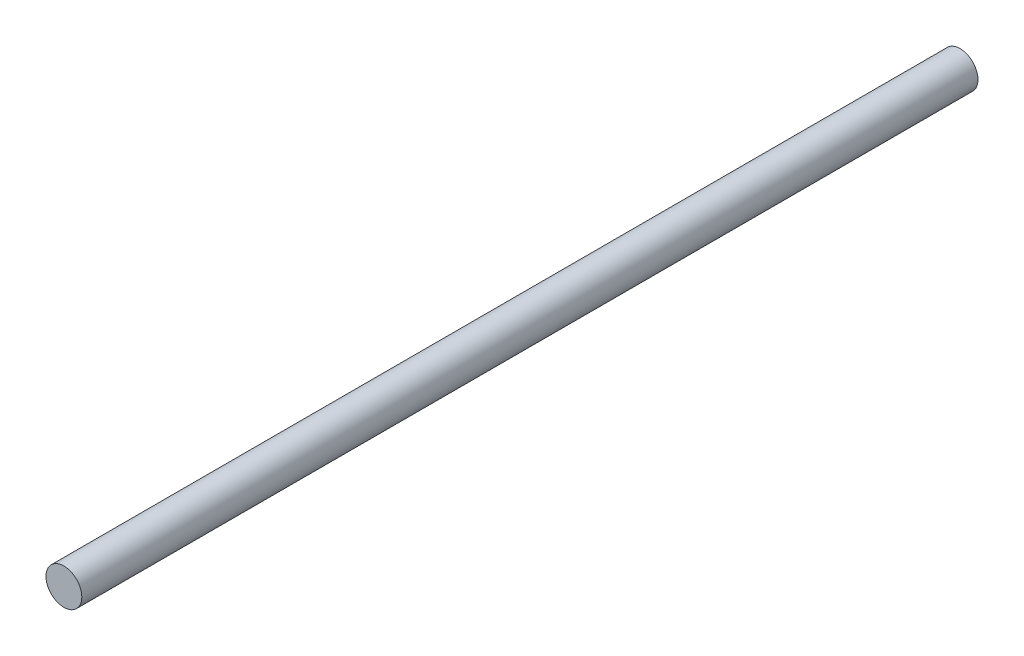
ISO-10303-21;
HEADER;
FILE_DESCRIPTION(('STEP AP214'),'2;1');
FILE_NAME('part.step','',(''),(''),'','','');
FILE_SCHEMA(('AUTOMOTIVE_DESIGN { 1 0 10303 214 1 1 1 1 }'));
ENDSEC;
DATA;
#1=APPLICATION_CONTEXT('core data for automotive mechanical design processes');
#2=APPLICATION_PROTOCOL_DEFINITION('international standard','automotive_design',2000,#1);
#3=PRODUCT_CONTEXT('',#1,'mechanical');
#4=PRODUCT('Part','Part','',(#3));
#5=PRODUCT_RELATED_PRODUCT_CATEGORY('part','',(#4));
#6=PRODUCT_DEFINITION_FORMATION('','',#4);
#7=PRODUCT_DEFINITION_CONTEXT('part definition',#1,'design');
#8=PRODUCT_DEFINITION('design','',#6,#7);
#9=PRODUCT_DEFINITION_SHAPE('','',#8);
#10=(LENGTH_UNIT() NAMED_UNIT(*) SI_UNIT(.MILLI.,.METRE.));
#11=(NAMED_UNIT(*) PLANE_ANGLE_UNIT() SI_UNIT($,.RADIAN.));
#12=(NAMED_UNIT(*) SI_UNIT($,.STERADIAN.) SOLID_ANGLE_UNIT());
#13=UNCERTAINTY_MEASURE_WITH_UNIT(LENGTH_MEASURE(1.E-05),#10,'distance_accuracy_value','');
#14=(GEOMETRIC_REPRESENTATION_CONTEXT(3) GLOBAL_UNCERTAINTY_ASSIGNED_CONTEXT((#13)) GLOBAL_UNIT_ASSIGNED_CONTEXT((#10,
#11,#12)) REPRESENTATION_CONTEXT('',''));
#15=CARTESIAN_POINT('',(0.,0.,0.));
#16=DIRECTION('',(0.,0.,1.));
#17=DIRECTION('',(1.,0.,0.));
#18=AXIS2_PLACEMENT_3D('',#15,#16,#17);
#19=CARTESIAN_POINT('',(0.,0.,500.));
#20=DIRECTION('',(0.,0.,-1.));
#21=DIRECTION('',(-1.,0.,0.));
#22=AXIS2_PLACEMENT_3D('',#19,#20,#21);
#23=CYLINDRICAL_SURFACE('',#22,10.);
#24=CARTESIAN_POINT('',(0.,0.,500.));
#25=DIRECTION('',(0.,0.,1.));
#26=DIRECTION('',(1.,0.,0.));
#27=AXIS2_PLACEMENT_3D('',#24,#25,#26);
#28=CIRCLE('',#27,10.);
#29=CARTESIAN_POINT('',(10.,0.,500.));
#30=VERTEX_POINT('',#29);
#31=EDGE_CURVE('E10',#30,#30,#28,.T.);
#32=ORIENTED_EDGE('',*,*,#31,.F.);
#33=EDGE_LOOP('',(#32));
#34=FACE_BOUND('',#33,.T.);
#35=CARTESIAN_POINT('',(0.,0.,0.));
#36=DIRECTION('',(0.,0.,1.));
#37=DIRECTION('',(1.,0.,0.));
#38=AXIS2_PLACEMENT_3D('',#35,#36,#37);
#39=CIRCLE('',#38,10.);
#40=CARTESIAN_POINT('',(10.,0.,0.));
#41=VERTEX_POINT('',#40);
#42=EDGE_CURVE('E38',#41,#41,#39,.T.);
#43=ORIENTED_EDGE('',*,*,#42,.T.);
#44=EDGE_LOOP('',(#43));
#45=FACE_BOUND('',#44,.T.);
#46=ADVANCED_FACE('F35',(#34,#45),#23,.T.);
#47=CARTESIAN_POINT('',(0.,0.,500.));
#48=DIRECTION('',(0.,0.,1.));
#49=DIRECTION('',(1.,0.,0.));
#50=AXIS2_PLACEMENT_3D('',#47,#48,#49);
#51=PLANE('',#50);
#52=ORIENTED_EDGE('',*,*,#31,.T.);
#53=EDGE_LOOP('',(#52));
#54=FACE_BOUND('',#53,.T.);
#55=ADVANCED_FACE('F50',(#54),#51,.T.);
#56=CARTESIAN_POINT('',(0.,0.,0.));
#57=DIRECTION('',(0.,0.,1.));
#58=DIRECTION('',(1.,0.,0.));
#59=AXIS2_PLACEMENT_3D('',#56,#57,#58);
#60=PLANE('',#59);
#61=ORIENTED_EDGE('',*,*,#42,.F.);
#62=EDGE_LOOP('',(#61));
#63=FACE_BOUND('',#62,.T.);
#64=ADVANCED_FACE('F48',(#63),#60,.F.);
#65=CLOSED_SHELL('',(#46,#55,#64));
#66=MANIFOLD_SOLID_BREP('B2',#65);
#67=ADVANCED_BREP_SHAPE_REPRESENTATION('',(#18,#66),#14);
#68=SHAPE_DEFINITION_REPRESENTATION(#9,#67);
ENDSEC;
END-ISO-10303-21;
